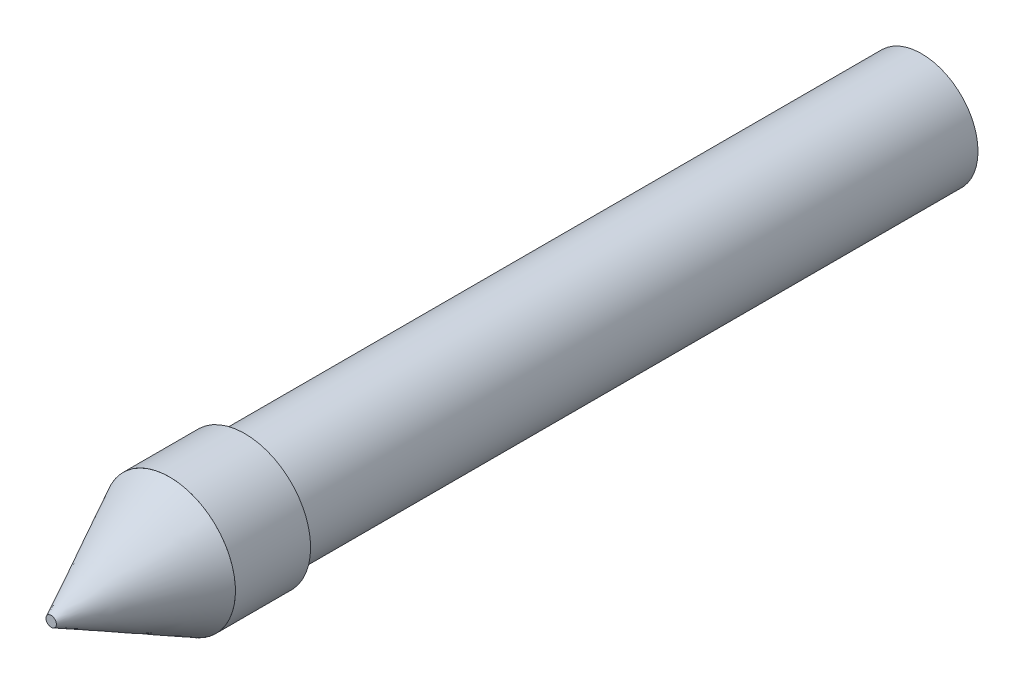
ISO-10303-21;
HEADER;
FILE_DESCRIPTION(('STEP AP214'),'2;1');
FILE_NAME('part.step','',(''),(''),'','','');
FILE_SCHEMA(('AUTOMOTIVE_DESIGN { 1 0 10303 214 1 1 1 1 }'));
ENDSEC;
DATA;
#1=APPLICATION_CONTEXT('core data for automotive mechanical design processes');
#2=APPLICATION_PROTOCOL_DEFINITION('international standard','automotive_design',2000,#1);
#3=PRODUCT_CONTEXT('',#1,'mechanical');
#4=PRODUCT('Part','Part','',(#3));
#5=PRODUCT_RELATED_PRODUCT_CATEGORY('part','',(#4));
#6=PRODUCT_DEFINITION_FORMATION('','',#4);
#7=PRODUCT_DEFINITION_CONTEXT('part definition',#1,'design');
#8=PRODUCT_DEFINITION('design','',#6,#7);
#9=PRODUCT_DEFINITION_SHAPE('','',#8);
#10=(LENGTH_UNIT() NAMED_UNIT(*) SI_UNIT(.MILLI.,.METRE.));
#11=(NAMED_UNIT(*) PLANE_ANGLE_UNIT() SI_UNIT($,.RADIAN.));
#12=(NAMED_UNIT(*) SI_UNIT($,.STERADIAN.) SOLID_ANGLE_UNIT());
#13=UNCERTAINTY_MEASURE_WITH_UNIT(LENGTH_MEASURE(1.E-05),#10,'distance_accuracy_value','');
#14=(GEOMETRIC_REPRESENTATION_CONTEXT(3) GLOBAL_UNCERTAINTY_ASSIGNED_CONTEXT((#13)) GLOBAL_UNIT_ASSIGNED_CONTEXT((#10,
#11,#12)) REPRESENTATION_CONTEXT('',''));
#15=CARTESIAN_POINT('',(0.,0.,0.));
#16=DIRECTION('',(0.,0.,1.));
#17=DIRECTION('',(1.,0.,0.));
#18=AXIS2_PLACEMENT_3D('',#15,#16,#17);
#19=CARTESIAN_POINT('',(0.,0.,254.));
#20=DIRECTION('',(0.,0.,1.));
#21=DIRECTION('',(1.,0.,0.));
#22=AXIS2_PLACEMENT_3D('',#19,#20,#21);
#23=PLANE('',#22);
#24=CARTESIAN_POINT('',(0.,0.,254.));
#25=DIRECTION('',(0.,0.,1.));
#26=DIRECTION('',(1.,0.,0.));
#27=AXIS2_PLACEMENT_3D('',#24,#25,#26);
#28=CIRCLE('',#27,22.225);
#29=CARTESIAN_POINT('',(-22.0733986582495,2.59146612441439,254.));
#30=VERTEX_POINT('',#29);
#31=EDGE_CURVE('E12',#30,#30,#28,.T.);
#32=ORIENTED_EDGE('',*,*,#31,.F.);
#33=EDGE_LOOP('',(#32));
#34=FACE_BOUND('',#33,.T.);
#35=ADVANCED_FACE('F52',(#34),#23,.F.);
#36=CARTESIAN_POINT('',(0.,0.,294.));
#37=DIRECTION('',(0.,0.,1.));
#38=DIRECTION('',(1.,0.,0.));
#39=AXIS2_PLACEMENT_3D('',#36,#37,#38);
#40=PLANE('',#39);
#41=CARTESIAN_POINT('',(0.,0.,294.));
#42=DIRECTION('',(0.,0.,1.));
#43=DIRECTION('',(1.,0.,0.));
#44=AXIS2_PLACEMENT_3D('',#41,#42,#43);
#45=CIRCLE('',#44,1.75);
#46=CARTESIAN_POINT('',(-1.60737780168176,0.691980203951471,294.));
#47=VERTEX_POINT('',#46);
#48=EDGE_CURVE('E60',#47,#47,#45,.T.);
#49=ORIENTED_EDGE('',*,*,#48,.T.);
#50=EDGE_LOOP('',(#49));
#51=FACE_BOUND('',#50,.T.);
#52=ADVANCED_FACE('F84',(#51),#40,.T.);
#53=CARTESIAN_POINT('',(-1.60737780168176,0.691980203951471,294.));
#54=CARTESIAN_POINT('',(-22.0733986582495,2.59146612441439,254.));
#55=CARTESIAN_POINT('',(-0.223417393778817,3.90673580731499,294.));
#56=CARTESIAN_POINT('',(-16.8904664094208,46.7382634409135,254.));
#57=CARTESIAN_POINT('',(2.9913382095847,2.52277539941204,294.));
#58=CARTESIAN_POINT('',(27.2563309070783,41.5553311920847,254.));
#59=CARTESIAN_POINT('',(1.60737780168176,-0.691980203951471,294.));
#60=CARTESIAN_POINT('',(22.0733986582495,-2.5914661244144,254.));
#61=CARTESIAN_POINT('',(0.223417393778817,-3.90673580731499,294.));
#62=CARTESIAN_POINT('',(16.8904664094207,-46.7382634409135,254.));
#63=CARTESIAN_POINT('',(-2.9913382095847,-2.52277539941205,294.));
#64=CARTESIAN_POINT('',(-27.2563309070784,-41.5553311920847,254.));
#65=CARTESIAN_POINT('',(-1.60737780168176,0.691980203951471,294.));
#66=CARTESIAN_POINT('',(-22.0733986582495,2.59146612441439,254.));
#67=(BOUNDED_SURFACE() B_SPLINE_SURFACE(3,1,((#53,#54),(#55,#56),(#57,#58),(#59,#60),(#61,#62),
(#63,#64),(#65,#66)),.UNSPECIFIED.,.T.,.F.,.F.) B_SPLINE_SURFACE_WITH_KNOTS((4,3,4),(2,2),(0.,
0.5,1.),(0.,1.),.UNSPECIFIED.) GEOMETRIC_REPRESENTATION_ITEM() RATIONAL_B_SPLINE_SURFACE(((1.,
1.),(0.333333333333333,0.333333333333333),(0.333333333333333,0.333333333333333),(1.,1.),
(0.333333333333333,0.333333333333333),(0.333333333333333,0.333333333333333),(1.,1.))) REPRESENTATION_ITEM('') SURFACE());
#68=CARTESIAN_POINT('',(-1.60737780168176,0.691980203951471,294.));
#69=CARTESIAN_POINT('',(-1.82056551893767,0.711766515622959,293.583333333333));
#70=CARTESIAN_POINT('',(-2.03375323619358,0.731552827294448,293.166666666667));
#71=CARTESIAN_POINT('',(-2.46012867070541,0.771125450637425,292.333333333333));
#72=CARTESIAN_POINT('',(-2.67331638796133,0.790911762308914,291.916666666667));
#73=CARTESIAN_POINT('',(-3.09969182247316,0.830484385651892,291.083333333333));
#74=CARTESIAN_POINT('',(-3.31287953972908,0.850270697323381,290.666666666667));
#75=CARTESIAN_POINT('',(-3.73925497424091,0.889843320666359,289.833333333333));
#76=CARTESIAN_POINT('',(-3.95244269149681,0.909629632337847,289.416666666667));
#77=CARTESIAN_POINT('',(-4.37881812600864,0.949202255680825,288.583333333333));
#78=CARTESIAN_POINT('',(-4.59200584326456,0.968988567352314,288.166666666667));
#79=CARTESIAN_POINT('',(-5.01838127777639,1.00856119069529,287.333333333333));
#80=CARTESIAN_POINT('',(-5.2315689950323,1.02834750236678,286.916666666667));
#81=CARTESIAN_POINT('',(-5.65794442954413,1.06792012570976,286.083333333333));
#82=CARTESIAN_POINT('',(-5.87113214680005,1.08770643738125,285.666666666667));
#83=CARTESIAN_POINT('',(-6.29750758131188,1.12727906072422,284.833333333333));
#84=CARTESIAN_POINT('',(-6.51069529856779,1.14706537239571,284.416666666667));
#85=CARTESIAN_POINT('',(-6.93707073307962,1.18663799573869,283.583333333333));
#86=CARTESIAN_POINT('',(-7.15025845033554,1.20642430741018,283.166666666667));
#87=CARTESIAN_POINT('',(-7.57663388484737,1.24599693075316,282.333333333333));
#88=CARTESIAN_POINT('',(-7.78982160210328,1.26578324242465,281.916666666667));
#89=CARTESIAN_POINT('',(-8.2161970366151,1.30535586576762,281.083333333333));
#90=CARTESIAN_POINT('',(-8.42938475387102,1.32514217743911,280.666666666667));
#91=CARTESIAN_POINT('',(-8.85576018838285,1.36471480078209,279.833333333333));
#92=CARTESIAN_POINT('',(-9.06894790563877,1.38450111245358,279.416666666667));
#93=CARTESIAN_POINT('',(-9.4953233401506,1.42407373579656,278.583333333333));
#94=CARTESIAN_POINT('',(-9.70851105740651,1.44386004746804,278.166666666667));
#95=CARTESIAN_POINT('',(-10.1348864919183,1.48343267081102,277.333333333333));
#96=CARTESIAN_POINT('',(-10.3480742091742,1.50321898248251,276.916666666667));
#97=CARTESIAN_POINT('',(-10.7744496436861,1.54279160582549,276.083333333333));
#98=CARTESIAN_POINT('',(-10.987637360942,1.56257791749698,275.666666666667));
#99=CARTESIAN_POINT('',(-11.4140127954538,1.60215054083996,274.833333333333));
#100=CARTESIAN_POINT('',(-11.6272005127097,1.62193685251144,274.416666666667));
#101=CARTESIAN_POINT('',(-12.0535759472216,1.66150947585442,273.583333333333));
#102=CARTESIAN_POINT('',(-12.2667636644775,1.68129578752591,273.166666666667));
#103=CARTESIAN_POINT('',(-12.6931390989893,1.72086841086889,272.333333333333));
#104=CARTESIAN_POINT('',(-12.9063268162452,1.74065472254038,271.916666666667));
#105=CARTESIAN_POINT('',(-13.332702250757,1.78022734588335,271.083333333333));
#106=CARTESIAN_POINT('',(-13.545889968013,1.80001365755484,270.666666666667));
#107=CARTESIAN_POINT('',(-13.9722654025248,1.83958628089782,269.833333333333));
#108=CARTESIAN_POINT('',(-14.1854531197807,1.85937259256931,269.416666666667));
#109=CARTESIAN_POINT('',(-14.6118285542925,1.89894521591229,268.583333333333));
#110=CARTESIAN_POINT('',(-14.8250162715485,1.91873152758378,268.166666666667));
#111=CARTESIAN_POINT('',(-15.2513917060603,1.95830415092675,267.333333333333));
#112=CARTESIAN_POINT('',(-15.4645794233162,1.97809046259824,266.916666666667));
#113=CARTESIAN_POINT('',(-15.890954857828,2.01766308594122,266.083333333333));
#114=CARTESIAN_POINT('',(-16.1041425750839,2.03744939761271,265.666666666667));
#115=CARTESIAN_POINT('',(-16.5305180095958,2.07702202095569,264.833333333333));
#116=CARTESIAN_POINT('',(-16.7437057268517,2.09680833262717,264.416666666667));
#117=CARTESIAN_POINT('',(-17.1700811613635,2.13638095597015,263.583333333333));
#118=CARTESIAN_POINT('',(-17.3832688786194,2.15616726764164,263.166666666667));
#119=CARTESIAN_POINT('',(-17.8096443131313,2.19573989098462,262.333333333333));
#120=CARTESIAN_POINT('',(-18.0228320303872,2.21552620265611,261.916666666667));
#121=CARTESIAN_POINT('',(-18.449207464899,2.25509882599909,261.083333333333));
#122=CARTESIAN_POINT('',(-18.6623951821549,2.27488513767057,260.666666666667));
#123=CARTESIAN_POINT('',(-19.0887706166667,2.31445776101355,259.833333333333));
#124=CARTESIAN_POINT('',(-19.3019583339227,2.33424407268504,259.416666666667));
#125=CARTESIAN_POINT('',(-19.7283337684345,2.37381669602802,258.583333333333));
#126=CARTESIAN_POINT('',(-19.9415214856904,2.39360300769951,258.166666666667));
#127=CARTESIAN_POINT('',(-20.3678969202022,2.43317563104248,257.333333333333));
#128=CARTESIAN_POINT('',(-20.5810846374581,2.45296194271397,256.916666666667));
#129=CARTESIAN_POINT('',(-21.00746007197,2.49253456605695,256.083333333333));
#130=CARTESIAN_POINT('',(-21.2206477892259,2.51232087772844,255.666666666667));
#131=CARTESIAN_POINT('',(-21.6470232237377,2.55189350107142,254.833333333333));
#132=CARTESIAN_POINT('',(-21.8602109409936,2.57167981274291,254.416666666667));
#133=CARTESIAN_POINT('',(-22.0733986582495,2.59146612441439,254.));
#134=B_SPLINE_CURVE_WITH_KNOTS('',3,(#68,#69,#70,#71,#72,#73,#74,#75,#76,#77,#78,#79,#80,#81,
#82,#83,#84,#85,#86,#87,#88,#89,#90,#91,#92,#93,#94,#95,#96,#97,#98,#99,#100,#101,#102,#103,
#104,#105,#106,#107,#108,#109,#110,#111,#112,#113,#114,#115,#116,#117,#118,#119,#120,#121,#122,
#123,#124,#125,#126,#127,#128,#129,#130,#131,#132,#133),.UNSPECIFIED.,.F.,.F.,(4,2,2,2,2,2,2,2,
2,2,2,2,2,2,2,2,2,2,2,2,2,2,2,2,2,2,2,2,2,2,2,2,4),(0.,1.4053698830789,2.81073976615776,
4.21610964923661,5.62147953231552,7.02684941539437,8.43221929847328,9.83758918155213,
11.242959064631,12.6483289477099,14.0536988307888,15.4590687138676,16.8644385969465,
18.2698084800254,19.6751783631043,21.0805482461832,22.485918129262,23.8912880123409,
25.2966578954198,26.7020277784987,28.1073976615775,29.5127675446565,30.9181374277353,
32.3235073108142,33.7288771938931,35.134247076972,36.5396169600508,37.9449868431297,
39.3503567262086,40.7557266092875,42.1610964923664,43.5664663754452,44.9718362585241),.UNSPECIFIED.);
#135=EDGE_CURVE('BSEAM92',#47,#30,#134,.T.);
#136=ORIENTED_EDGE('',*,*,#48,.F.);
#137=ORIENTED_EDGE('',*,*,#31,.T.);
#138=ORIENTED_EDGE('',*,*,#135,.T.);
#139=ORIENTED_EDGE('',*,*,#135,.F.);
#140=EDGE_LOOP('',(#136,#138,#137,#139));
#141=FACE_BOUND('',#140,.T.);
#142=ADVANCED_FACE('F92',(#141),#67,.T.);
#143=CLOSED_SHELL('',(#35,#52,#142));
#144=MANIFOLD_SOLID_BREP('B2',#143);
#145=CARTESIAN_POINT('',(0.,0.,228.6));
#146=DIRECTION('',(0.,0.,1.));
#147=DIRECTION('',(1.,0.,0.));
#148=AXIS2_PLACEMENT_3D('',#145,#146,#147);
#149=CYLINDRICAL_SURFACE('',#148,22.225);
#150=CARTESIAN_POINT('',(0.,0.,228.6));
#151=DIRECTION('',(0.,0.,1.));
#152=DIRECTION('',(1.,0.,0.));
#153=AXIS2_PLACEMENT_3D('',#150,#151,#152);
#154=CIRCLE('',#153,22.225);
#155=CARTESIAN_POINT('',(22.225,0.,228.6));
#156=VERTEX_POINT('',#155);
#157=EDGE_CURVE('E51',#156,#156,#154,.T.);
#158=ORIENTED_EDGE('',*,*,#157,.T.);
#159=EDGE_LOOP('',(#158));
#160=FACE_BOUND('',#159,.T.);
#161=CARTESIAN_POINT('',(0.,0.,254.));
#162=DIRECTION('',(0.,0.,1.));
#163=DIRECTION('',(1.,0.,0.));
#164=AXIS2_PLACEMENT_3D('',#161,#162,#163);
#165=CIRCLE('',#164,22.225);
#166=CARTESIAN_POINT('',(22.225,0.,254.));
#167=VERTEX_POINT('',#166);
#168=EDGE_CURVE('E154',#167,#167,#165,.T.);
#169=ORIENTED_EDGE('',*,*,#168,.F.);
#170=EDGE_LOOP('',(#169));
#171=FACE_BOUND('',#170,.T.);
#172=ADVANCED_FACE('F151',(#160,#171),#149,.T.);
#173=CARTESIAN_POINT('',(0.,0.,228.6));
#174=DIRECTION('',(0.,0.,1.));
#175=DIRECTION('',(1.,0.,0.));
#176=AXIS2_PLACEMENT_3D('',#173,#174,#175);
#177=PLANE('',#176);
#178=CARTESIAN_POINT('',(0.,0.,228.6));
#179=DIRECTION('',(0.,0.,1.));
#180=DIRECTION('',(1.,0.,0.));
#181=AXIS2_PLACEMENT_3D('',#178,#179,#180);
#182=CIRCLE('',#181,19.05);
#183=CARTESIAN_POINT('',(19.05,0.,228.6));
#184=VERTEX_POINT('',#183);
#185=EDGE_CURVE('E161',#184,#184,#182,.T.);
#186=ORIENTED_EDGE('',*,*,#185,.T.);
#187=EDGE_LOOP('',(#186));
#188=FACE_BOUND('',#187,.T.);
#189=ORIENTED_EDGE('',*,*,#157,.F.);
#190=EDGE_LOOP('',(#189));
#191=FACE_BOUND('',#190,.T.);
#192=ADVANCED_FACE('F169',(#188,#191),#177,.F.);
#193=CARTESIAN_POINT('',(0.,0.,254.));
#194=DIRECTION('',(0.,0.,1.));
#195=DIRECTION('',(1.,0.,0.));
#196=AXIS2_PLACEMENT_3D('',#193,#194,#195);
#197=PLANE('',#196);
#198=CARTESIAN_POINT('',(0.,0.,254.));
#199=DIRECTION('',(0.,0.,1.));
#200=DIRECTION('',(1.,0.,0.));
#201=AXIS2_PLACEMENT_3D('',#198,#199,#200);
#202=CIRCLE('',#201,19.05);
#203=CARTESIAN_POINT('',(19.05,0.,254.));
#204=VERTEX_POINT('',#203);
#205=EDGE_CURVE('E163',#204,#204,#202,.T.);
#206=ORIENTED_EDGE('',*,*,#205,.F.);
#207=EDGE_LOOP('',(#206));
#208=FACE_BOUND('',#207,.T.);
#209=ORIENTED_EDGE('',*,*,#168,.T.);
#210=EDGE_LOOP('',(#209));
#211=FACE_BOUND('',#210,.T.);
#212=ADVANCED_FACE('F175',(#208,#211),#197,.T.);
#213=CARTESIAN_POINT('',(0.,0.,228.6));
#214=DIRECTION('',(0.,0.,1.));
#215=DIRECTION('',(1.,0.,0.));
#216=AXIS2_PLACEMENT_3D('',#213,#214,#215);
#217=CYLINDRICAL_SURFACE('',#216,19.05);
#218=ORIENTED_EDGE('',*,*,#185,.F.);
#219=EDGE_LOOP('',(#218));
#220=FACE_BOUND('',#219,.T.);
#221=ORIENTED_EDGE('',*,*,#205,.T.);
#222=EDGE_LOOP('',(#221));
#223=FACE_BOUND('',#222,.T.);
#224=ADVANCED_FACE('F172',(#220,#223),#217,.F.);
#225=CLOSED_SHELL('',(#172,#192,#212,#224));
#226=MANIFOLD_SOLID_BREP('B7',#225);
#227=CARTESIAN_POINT('',(0.,0.,254.));
#228=DIRECTION('',(0.,0.,1.));
#229=DIRECTION('',(1.,0.,0.));
#230=AXIS2_PLACEMENT_3D('',#227,#228,#229);
#231=PLANE('',#230);
#232=CARTESIAN_POINT('',(0.,0.,254.));
#233=DIRECTION('',(0.,0.,1.));
#234=DIRECTION('',(1.,0.,0.));
#235=AXIS2_PLACEMENT_3D('',#232,#233,#234);
#236=CIRCLE('',#235,19.05);
#237=CARTESIAN_POINT('',(19.05,0.,254.));
#238=VERTEX_POINT('',#237);
#239=EDGE_CURVE('E150',#238,#238,#236,.T.);
#240=ORIENTED_EDGE('',*,*,#239,.T.);
#241=EDGE_LOOP('',(#240));
#242=FACE_BOUND('',#241,.T.);
#243=CARTESIAN_POINT('',(0.,0.,254.));
#244=DIRECTION('',(0.,0.,1.));
#245=DIRECTION('',(1.,0.,0.));
#246=AXIS2_PLACEMENT_3D('',#243,#244,#245);
#247=CIRCLE('',#246,15.875);
#248=CARTESIAN_POINT('',(15.875,0.,254.));
#249=VERTEX_POINT('',#248);
#250=EDGE_CURVE('E224',#249,#249,#247,.T.);
#251=ORIENTED_EDGE('',*,*,#250,.F.);
#252=EDGE_LOOP('',(#251));
#253=FACE_BOUND('',#252,.T.);
#254=ADVANCED_FACE('F213',(#242,#253),#231,.T.);
#255=CARTESIAN_POINT('',(0.,0.,0.));
#256=DIRECTION('',(0.,0.,1.));
#257=DIRECTION('',(1.,0.,0.));
#258=AXIS2_PLACEMENT_3D('',#255,#256,#257);
#259=PLANE('',#258);
#260=CARTESIAN_POINT('',(0.,0.,0.));
#261=DIRECTION('',(0.,0.,1.));
#262=DIRECTION('',(1.,0.,0.));
#263=AXIS2_PLACEMENT_3D('',#260,#261,#262);
#264=CIRCLE('',#263,19.05);
#265=CARTESIAN_POINT('',(19.05,0.,0.));
#266=VERTEX_POINT('',#265);
#267=EDGE_CURVE('E217',#266,#266,#264,.T.);
#268=ORIENTED_EDGE('',*,*,#267,.F.);
#269=EDGE_LOOP('',(#268));
#270=FACE_BOUND('',#269,.T.);
#271=CARTESIAN_POINT('',(0.,0.,0.));
#272=DIRECTION('',(0.,0.,1.));
#273=DIRECTION('',(1.,0.,0.));
#274=AXIS2_PLACEMENT_3D('',#271,#272,#273);
#275=CIRCLE('',#274,15.875);
#276=CARTESIAN_POINT('',(15.875,0.,0.));
#277=VERTEX_POINT('',#276);
#278=EDGE_CURVE('E226',#277,#277,#275,.T.);
#279=ORIENTED_EDGE('',*,*,#278,.T.);
#280=EDGE_LOOP('',(#279));
#281=FACE_BOUND('',#280,.T.);
#282=ADVANCED_FACE('F236',(#270,#281),#259,.F.);
#283=CARTESIAN_POINT('',(0.,0.,254.));
#284=DIRECTION('',(0.,0.,-1.));
#285=DIRECTION('',(-1.,0.,0.));
#286=AXIS2_PLACEMENT_3D('',#283,#284,#285);
#287=CYLINDRICAL_SURFACE('',#286,19.05);
#288=ORIENTED_EDGE('',*,*,#239,.F.);
#289=EDGE_LOOP('',(#288));
#290=FACE_BOUND('',#289,.T.);
#291=ORIENTED_EDGE('',*,*,#267,.T.);
#292=EDGE_LOOP('',(#291));
#293=FACE_BOUND('',#292,.T.);
#294=ADVANCED_FACE('F215',(#290,#293),#287,.T.);
#295=CARTESIAN_POINT('',(0.,0.,254.));
#296=DIRECTION('',(0.,0.,-1.));
#297=DIRECTION('',(-1.,0.,0.));
#298=AXIS2_PLACEMENT_3D('',#295,#296,#297);
#299=CYLINDRICAL_SURFACE('',#298,15.875);
#300=ORIENTED_EDGE('',*,*,#250,.T.);
#301=EDGE_LOOP('',(#300));
#302=FACE_BOUND('',#301,.T.);
#303=ORIENTED_EDGE('',*,*,#278,.F.);
#304=EDGE_LOOP('',(#303));
#305=FACE_BOUND('',#304,.T.);
#306=ADVANCED_FACE('F232',(#302,#305),#299,.F.);
#307=CLOSED_SHELL('',(#254,#282,#294,#306));
#308=MANIFOLD_SOLID_BREP('B46_NOT_SHOWN',#307);
#309=ADVANCED_BREP_SHAPE_REPRESENTATION('',(#18,#144,#226,#308),#14);
#310=SHAPE_DEFINITION_REPRESENTATION(#9,#309);
ENDSEC;
END-ISO-10303-21;
